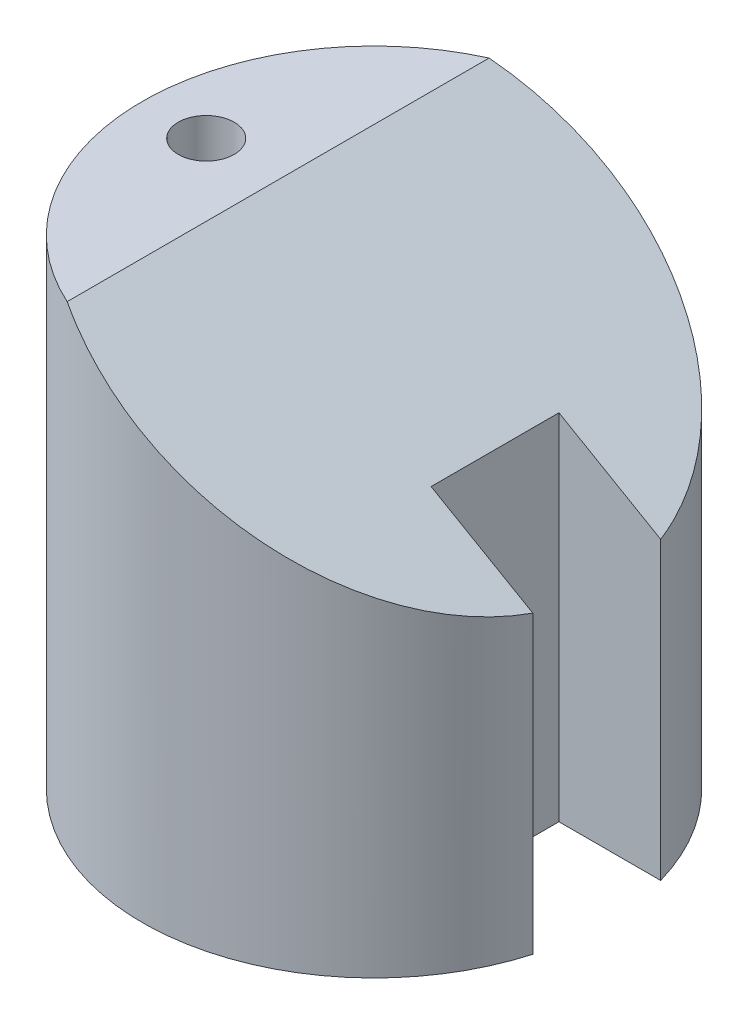
ISO-10303-21;
HEADER;
FILE_DESCRIPTION(('STEP AP214'),'2;1');
FILE_NAME('part.step','',(''),(''),'','','');
FILE_SCHEMA(('AUTOMOTIVE_DESIGN { 1 0 10303 214 1 1 1 1 }'));
ENDSEC;
DATA;
#1=APPLICATION_CONTEXT('core data for automotive mechanical design processes');
#2=APPLICATION_PROTOCOL_DEFINITION('international standard','automotive_design',2000,#1);
#3=PRODUCT_CONTEXT('',#1,'mechanical');
#4=PRODUCT('Part','Part','',(#3));
#5=PRODUCT_RELATED_PRODUCT_CATEGORY('part','',(#4));
#6=PRODUCT_DEFINITION_FORMATION('','',#4);
#7=PRODUCT_DEFINITION_CONTEXT('part definition',#1,'design');
#8=PRODUCT_DEFINITION('design','',#6,#7);
#9=PRODUCT_DEFINITION_SHAPE('','',#8);
#10=(LENGTH_UNIT() NAMED_UNIT(*) SI_UNIT(.MILLI.,.METRE.));
#11=(NAMED_UNIT(*) PLANE_ANGLE_UNIT() SI_UNIT($,.RADIAN.));
#12=(NAMED_UNIT(*) SI_UNIT($,.STERADIAN.) SOLID_ANGLE_UNIT());
#13=UNCERTAINTY_MEASURE_WITH_UNIT(LENGTH_MEASURE(1.E-05),#10,'distance_accuracy_value','');
#14=(GEOMETRIC_REPRESENTATION_CONTEXT(3) GLOBAL_UNCERTAINTY_ASSIGNED_CONTEXT((#13)) GLOBAL_UNIT_ASSIGNED_CONTEXT((#10,
#11,#12)) REPRESENTATION_CONTEXT('',''));
#15=CARTESIAN_POINT('',(0.,0.,0.));
#16=DIRECTION('',(0.,0.,1.));
#17=DIRECTION('',(1.,0.,0.));
#18=AXIS2_PLACEMENT_3D('',#15,#16,#17);
#19=CARTESIAN_POINT('',(0.,60.,0.));
#20=DIRECTION('',(0.,-1.,0.));
#21=DIRECTION('',(0.,0.,-1.));
#22=AXIS2_PLACEMENT_3D('',#19,#20,#21);
#23=CYLINDRICAL_SURFACE('',#22,29.);
#24=CARTESIAN_POINT('',(0.,0.,0.));
#25=DIRECTION('',(0.,1.,0.));
#26=DIRECTION('',(0.,0.,1.));
#27=AXIS2_PLACEMENT_3D('',#24,#25,#26);
#28=CIRCLE('',#27,29.);
#29=CARTESIAN_POINT('',(27.8747197295327,0.,-8.));
#30=VERTEX_POINT('',#29);
#31=CARTESIAN_POINT('',(27.8747197295327,0.,8.));
#32=VERTEX_POINT('',#31);
#33=EDGE_CURVE('E100',#30,#32,#28,.T.);
#34=ORIENTED_EDGE('',*,*,#33,.T.);
#35=DIRECTION('',(0.,-1.,0.));
#36=VECTOR('',#35,1.);
#37=CARTESIAN_POINT('',(27.8747197295327,60.,8.));
#38=LINE('',#37,#36);
#39=CARTESIAN_POINT('',(27.8747197295327,36.9783198302937,8.));
#40=VERTEX_POINT('',#39);
#41=EDGE_CURVE('E109',#32,#40,#38,.F.);
#42=ORIENTED_EDGE('',*,*,#41,.T.);
#43=CARTESIAN_POINT('',(0.,53.0717967697246,0.));
#44=DIRECTION('',(-0.499999999999995,-0.866025403784442,0.));
#45=DIRECTION('',(0.866025403784442,-0.499999999999995,0.));
#46=AXIS2_PLACEMENT_3D('',#43,#44,#45);
#47=ELLIPSE('',#46,33.4863156129982,29.);
#48=CARTESIAN_POINT('',(-12.,60.,26.4007575648882));
#49=VERTEX_POINT('',#48);
#50=EDGE_CURVE('E112',#40,#49,#47,.T.);
#51=ORIENTED_EDGE('',*,*,#50,.T.);
#52=CARTESIAN_POINT('',(0.,60.,0.));
#53=DIRECTION('',(0.,1.,0.));
#54=DIRECTION('',(0.,0.,1.));
#55=AXIS2_PLACEMENT_3D('',#52,#53,#54);
#56=CIRCLE('',#55,29.);
#57=CARTESIAN_POINT('',(-12.,60.,-26.4007575648882));
#58=VERTEX_POINT('',#57);
#59=EDGE_CURVE('E114',#58,#49,#56,.T.);
#60=ORIENTED_EDGE('',*,*,#59,.F.);
#61=CARTESIAN_POINT('',(27.8747197295327,36.9783198302937,-8.));
#62=VERTEX_POINT('',#61);
#63=EDGE_CURVE('E54',#58,#62,#47,.T.);
#64=ORIENTED_EDGE('',*,*,#63,.T.);
#65=DIRECTION('',(0.,-1.,0.));
#66=VECTOR('',#65,1.);
#67=CARTESIAN_POINT('',(27.8747197295327,60.,-8.));
#68=LINE('',#67,#66);
#69=EDGE_CURVE('E47',#30,#62,#68,.F.);
#70=ORIENTED_EDGE('',*,*,#69,.F.);
#71=EDGE_LOOP('',(#34,#42,#51,#60,#64,#70));
#72=FACE_BOUND('',#71,.T.);
#73=ADVANCED_FACE('F33',(#72),#23,.T.);
#74=CARTESIAN_POINT('',(0.,60.,0.));
#75=DIRECTION('',(0.,1.,0.));
#76=DIRECTION('',(0.,0.,1.));
#77=AXIS2_PLACEMENT_3D('',#74,#75,#76);
#78=PLANE('',#77);
#79=CARTESIAN_POINT('',(-21.,60.,0.));
#80=DIRECTION('',(0.,1.,0.));
#81=DIRECTION('',(0.,0.,1.));
#82=AXIS2_PLACEMENT_3D('',#79,#80,#81);
#83=CIRCLE('',#82,3.5);
#84=CARTESIAN_POINT('',(-21.,60.,3.5));
#85=VERTEX_POINT('',#84);
#86=EDGE_CURVE('E158',#85,#85,#83,.T.);
#87=ORIENTED_EDGE('',*,*,#86,.F.);
#88=EDGE_LOOP('',(#87));
#89=FACE_BOUND('',#88,.T.);
#90=DIRECTION('',(0.,0.,1.));
#91=VECTOR('',#90,1.);
#92=CARTESIAN_POINT('',(-12.,60.,0.));
#93=LINE('',#92,#91);
#94=EDGE_CURVE('E117',#58,#49,#93,.T.);
#95=ORIENTED_EDGE('',*,*,#94,.F.);
#96=ORIENTED_EDGE('',*,*,#59,.T.);
#97=EDGE_LOOP('',(#95,#96));
#98=FACE_BOUND('',#97,.T.);
#99=ADVANCED_FACE('F123',(#89,#98),#78,.T.);
#100=CARTESIAN_POINT('',(0.,0.,0.));
#101=DIRECTION('',(0.,1.,0.));
#102=DIRECTION('',(0.,0.,1.));
#103=AXIS2_PLACEMENT_3D('',#100,#101,#102);
#104=PLANE('',#103);
#105=CARTESIAN_POINT('',(-21.,0.,0.));
#106=DIRECTION('',(0.,1.,0.));
#107=DIRECTION('',(0.,0.,1.));
#108=AXIS2_PLACEMENT_3D('',#105,#106,#107);
#109=CIRCLE('',#108,3.5);
#110=CARTESIAN_POINT('',(-21.,0.,3.5));
#111=VERTEX_POINT('',#110);
#112=EDGE_CURVE('E95',#111,#111,#109,.F.);
#113=ORIENTED_EDGE('',*,*,#112,.F.);
#114=EDGE_LOOP('',(#113));
#115=FACE_BOUND('',#114,.T.);
#116=DIRECTION('',(0.,0.,-1.));
#117=VECTOR('',#116,1.);
#118=CARTESIAN_POINT('',(15.143593539449,0.,8.));
#119=LINE('',#118,#117);
#120=CARTESIAN_POINT('',(15.143593539449,0.,8.));
#121=VERTEX_POINT('',#120);
#122=CARTESIAN_POINT('',(15.143593539449,0.,-8.));
#123=VERTEX_POINT('',#122);
#124=EDGE_CURVE('E81',#121,#123,#119,.T.);
#125=ORIENTED_EDGE('',*,*,#124,.F.);
#126=DIRECTION('',(1.,0.,0.));
#127=VECTOR('',#126,1.);
#128=CARTESIAN_POINT('',(29.,0.,8.));
#129=LINE('',#128,#127);
#130=EDGE_CURVE('E102',#121,#32,#129,.T.);
#131=ORIENTED_EDGE('',*,*,#130,.T.);
#132=ORIENTED_EDGE('',*,*,#33,.F.);
#133=DIRECTION('',(1.,0.,0.));
#134=VECTOR('',#133,1.);
#135=CARTESIAN_POINT('',(29.,0.,-8.));
#136=LINE('',#135,#134);
#137=EDGE_CURVE('E94',#123,#30,#136,.T.);
#138=ORIENTED_EDGE('',*,*,#137,.F.);
#139=EDGE_LOOP('',(#125,#131,#132,#138));
#140=FACE_BOUND('',#139,.T.);
#141=ADVANCED_FACE('F98',(#115,#140),#104,.F.);
#142=CARTESIAN_POINT('',(-12.,60.,-29.));
#143=DIRECTION('',(-0.499999999999995,-0.866025403784442,0.));
#144=DIRECTION('',(0.866025403784442,-0.499999999999995,0.));
#145=AXIS2_PLACEMENT_3D('',#142,#143,#144);
#146=PLANE('',#145);
#147=ORIENTED_EDGE('',*,*,#50,.F.);
#148=DIRECTION('',(-0.866025403784442,0.499999999999995,0.));
#149=VECTOR('',#148,1.);
#150=CARTESIAN_POINT('',(-12.,60.,8.));
#151=LINE('',#150,#149);
#152=CARTESIAN_POINT('',(15.143593539449,44.3286389632257,8.));
#153=VERTEX_POINT('',#152);
#154=EDGE_CURVE('E11',#40,#153,#151,.T.);
#155=ORIENTED_EDGE('',*,*,#154,.T.);
#156=DIRECTION('',(0.,0.,-1.));
#157=VECTOR('',#156,1.);
#158=CARTESIAN_POINT('',(15.143593539449,44.3286389632257,8.));
#159=LINE('',#158,#157);
#160=CARTESIAN_POINT('',(15.143593539449,44.3286389632257,-8.));
#161=VERTEX_POINT('',#160);
#162=EDGE_CURVE('E91',#153,#161,#159,.T.);
#163=ORIENTED_EDGE('',*,*,#162,.T.);
#164=DIRECTION('',(-0.866025403784442,0.499999999999995,0.));
#165=VECTOR('',#164,1.);
#166=CARTESIAN_POINT('',(-12.,60.,-8.));
#167=LINE('',#166,#165);
#168=EDGE_CURVE('E40',#62,#161,#167,.T.);
#169=ORIENTED_EDGE('',*,*,#168,.F.);
#170=ORIENTED_EDGE('',*,*,#63,.F.);
#171=ORIENTED_EDGE('',*,*,#94,.T.);
#172=EDGE_LOOP('',(#147,#155,#163,#169,#170,#171));
#173=FACE_BOUND('',#172,.T.);
#174=ADVANCED_FACE('F120',(#173),#146,.F.);
#175=CARTESIAN_POINT('',(0.,0.,8.));
#176=DIRECTION('',(0.,0.,1.));
#177=DIRECTION('',(1.,0.,0.));
#178=AXIS2_PLACEMENT_3D('',#175,#176,#177);
#179=PLANE('',#178);
#180=ORIENTED_EDGE('',*,*,#130,.F.);
#181=DIRECTION('',(0.,-1.,0.));
#182=VECTOR('',#181,1.);
#183=CARTESIAN_POINT('',(15.143593539449,0.,8.));
#184=LINE('',#183,#182);
#185=EDGE_CURVE('E87',#153,#121,#184,.T.);
#186=ORIENTED_EDGE('',*,*,#185,.F.);
#187=ORIENTED_EDGE('',*,*,#154,.F.);
#188=ORIENTED_EDGE('',*,*,#41,.F.);
#189=EDGE_LOOP('',(#180,#186,#187,#188));
#190=FACE_BOUND('',#189,.T.);
#191=ADVANCED_FACE('F126',(#190),#179,.F.);
#192=CARTESIAN_POINT('',(0.,0.,-8.));
#193=DIRECTION('',(0.,0.,1.));
#194=DIRECTION('',(1.,0.,0.));
#195=AXIS2_PLACEMENT_3D('',#192,#193,#194);
#196=PLANE('',#195);
#197=ORIENTED_EDGE('',*,*,#69,.T.);
#198=ORIENTED_EDGE('',*,*,#168,.T.);
#199=DIRECTION('',(0.,-1.,0.));
#200=VECTOR('',#199,1.);
#201=CARTESIAN_POINT('',(15.143593539449,0.,-8.));
#202=LINE('',#201,#200);
#203=EDGE_CURVE('E84',#161,#123,#202,.T.);
#204=ORIENTED_EDGE('',*,*,#203,.T.);
#205=ORIENTED_EDGE('',*,*,#137,.T.);
#206=EDGE_LOOP('',(#197,#198,#204,#205));
#207=FACE_BOUND('',#206,.T.);
#208=ADVANCED_FACE('F93',(#207),#196,.T.);
#209=CARTESIAN_POINT('',(15.143593539449,0.,8.));
#210=DIRECTION('',(1.,0.,0.));
#211=DIRECTION('',(0.,0.,-1.));
#212=AXIS2_PLACEMENT_3D('',#209,#210,#211);
#213=PLANE('',#212);
#214=ORIENTED_EDGE('',*,*,#162,.F.);
#215=ORIENTED_EDGE('',*,*,#185,.T.);
#216=ORIENTED_EDGE('',*,*,#124,.T.);
#217=ORIENTED_EDGE('',*,*,#203,.F.);
#218=EDGE_LOOP('',(#214,#215,#216,#217));
#219=FACE_BOUND('',#218,.T.);
#220=ADVANCED_FACE('F83',(#219),#213,.T.);
#221=CARTESIAN_POINT('',(-21.,-0.001000000000001,0.));
#222=DIRECTION('',(0.,1.,0.));
#223=DIRECTION('',(0.,0.,1.));
#224=AXIS2_PLACEMENT_3D('',#221,#222,#223);
#225=CYLINDRICAL_SURFACE('',#224,3.5);
#226=ORIENTED_EDGE('',*,*,#86,.T.);
#227=EDGE_LOOP('',(#226));
#228=FACE_BOUND('',#227,.T.);
#229=ORIENTED_EDGE('',*,*,#112,.T.);
#230=EDGE_LOOP('',(#229));
#231=FACE_BOUND('',#230,.T.);
#232=ADVANCED_FACE('F148',(#228,#231),#225,.F.);
#233=CLOSED_SHELL('',(#73,#99,#141,#174,#191,#208,#220,#232));
#234=MANIFOLD_SOLID_BREP('B2',#233);
#235=ADVANCED_BREP_SHAPE_REPRESENTATION('',(#18,#234),#14);
#236=SHAPE_DEFINITION_REPRESENTATION(#9,#235);
ENDSEC;
END-ISO-10303-21;
